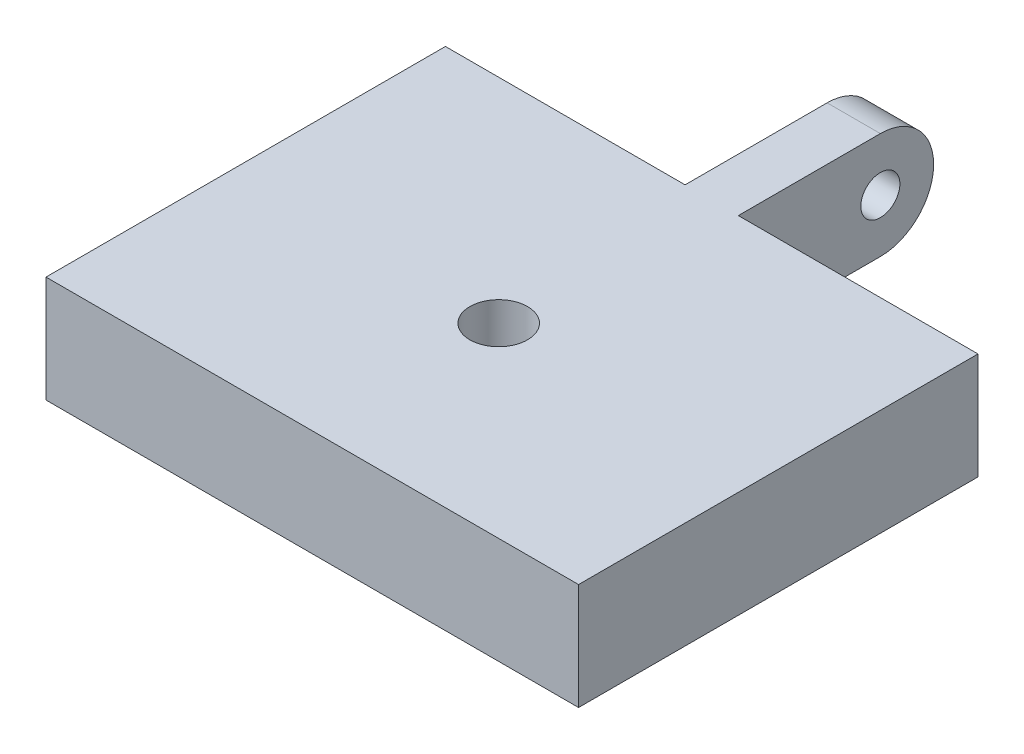
ISO-10303-21;
HEADER;
FILE_DESCRIPTION(('STEP AP214'),'2;1');
FILE_NAME('part.step','',(''),(''),'','','');
FILE_SCHEMA(('AUTOMOTIVE_DESIGN { 1 0 10303 214 1 1 1 1 }'));
ENDSEC;
DATA;
#1=APPLICATION_CONTEXT('core data for automotive mechanical design processes');
#2=APPLICATION_PROTOCOL_DEFINITION('international standard','automotive_design',2000,#1);
#3=PRODUCT_CONTEXT('',#1,'mechanical');
#4=PRODUCT('Part','Part','',(#3));
#5=PRODUCT_RELATED_PRODUCT_CATEGORY('part','',(#4));
#6=PRODUCT_DEFINITION_FORMATION('','',#4);
#7=PRODUCT_DEFINITION_CONTEXT('part definition',#1,'design');
#8=PRODUCT_DEFINITION('design','',#6,#7);
#9=PRODUCT_DEFINITION_SHAPE('','',#8);
#10=(LENGTH_UNIT() NAMED_UNIT(*) SI_UNIT(.MILLI.,.METRE.));
#11=(NAMED_UNIT(*) PLANE_ANGLE_UNIT() SI_UNIT($,.RADIAN.));
#12=(NAMED_UNIT(*) SI_UNIT($,.STERADIAN.) SOLID_ANGLE_UNIT());
#13=UNCERTAINTY_MEASURE_WITH_UNIT(LENGTH_MEASURE(1.E-05),#10,'distance_accuracy_value','');
#14=(GEOMETRIC_REPRESENTATION_CONTEXT(3) GLOBAL_UNCERTAINTY_ASSIGNED_CONTEXT((#13)) GLOBAL_UNIT_ASSIGNED_CONTEXT((#10,
#11,#12)) REPRESENTATION_CONTEXT('',''));
#15=CARTESIAN_POINT('',(0.,0.,0.));
#16=DIRECTION('',(0.,0.,1.));
#17=DIRECTION('',(1.,0.,0.));
#18=AXIS2_PLACEMENT_3D('',#15,#16,#17);
#19=CARTESIAN_POINT('',(3.,0.,0.));
#20=DIRECTION('',(1.,0.,0.));
#21=DIRECTION('',(0.,0.,-1.));
#22=AXIS2_PLACEMENT_3D('',#19,#20,#21);
#23=PLANE('',#22);
#24=CARTESIAN_POINT('',(3.,0.,0.));
#25=DIRECTION('',(1.,0.,0.));
#26=DIRECTION('',(0.,0.,-1.));
#27=AXIS2_PLACEMENT_3D('',#24,#25,#26);
#28=CIRCLE('',#27,2.2);
#29=CARTESIAN_POINT('',(3.,0.,-2.2));
#30=VERTEX_POINT('',#29);
#31=EDGE_CURVE('E193',#30,#30,#28,.F.);
#32=ORIENTED_EDGE('',*,*,#31,.T.);
#33=EDGE_LOOP('',(#32));
#34=FACE_BOUND('',#33,.T.);
#35=DIRECTION('',(0.,0.,1.));
#36=VECTOR('',#35,1.);
#37=CARTESIAN_POINT('',(3.,6.,18.));
#38=LINE('',#37,#36);
#39=CARTESIAN_POINT('',(3.,6.,0.));
#40=VERTEX_POINT('',#39);
#41=CARTESIAN_POINT('',(3.,6.,16.));
#42=VERTEX_POINT('',#41);
#43=EDGE_CURVE('E143',#40,#42,#38,.T.);
#44=ORIENTED_EDGE('',*,*,#43,.T.);
#45=DIRECTION('',(0.,-1.,0.));
#46=VECTOR('',#45,1.);
#47=CARTESIAN_POINT('',(3.,0.,16.));
#48=LINE('',#47,#46);
#49=CARTESIAN_POINT('',(3.,-6.,16.));
#50=VERTEX_POINT('',#49);
#51=EDGE_CURVE('E112',#42,#50,#48,.T.);
#52=ORIENTED_EDGE('',*,*,#51,.T.);
#53=DIRECTION('',(0.,0.,-1.));
#54=VECTOR('',#53,1.);
#55=CARTESIAN_POINT('',(3.,-6.,18.));
#56=LINE('',#55,#54);
#57=CARTESIAN_POINT('',(3.,-6.,0.));
#58=VERTEX_POINT('',#57);
#59=EDGE_CURVE('E55',#50,#58,#56,.T.);
#60=ORIENTED_EDGE('',*,*,#59,.T.);
#61=CARTESIAN_POINT('',(3.,0.,0.));
#62=DIRECTION('',(1.,0.,0.));
#63=DIRECTION('',(0.,0.,-1.));
#64=AXIS2_PLACEMENT_3D('',#61,#62,#63);
#65=CIRCLE('',#64,6.);
#66=EDGE_CURVE('E11',#58,#40,#65,.T.);
#67=ORIENTED_EDGE('',*,*,#66,.T.);
#68=EDGE_LOOP('',(#44,#52,#60,#67));
#69=FACE_BOUND('',#68,.T.);
#70=ADVANCED_FACE('F39',(#34,#69),#23,.T.);
#71=CARTESIAN_POINT('',(-3.,0.,0.));
#72=DIRECTION('',(1.,0.,0.));
#73=DIRECTION('',(0.,0.,-1.));
#74=AXIS2_PLACEMENT_3D('',#71,#72,#73);
#75=PLANE('',#74);
#76=CARTESIAN_POINT('',(-3.,0.,0.));
#77=DIRECTION('',(1.,0.,0.));
#78=DIRECTION('',(0.,0.,-1.));
#79=AXIS2_PLACEMENT_3D('',#76,#77,#78);
#80=CIRCLE('',#79,2.2);
#81=CARTESIAN_POINT('',(-3.,0.,-2.2));
#82=VERTEX_POINT('',#81);
#83=EDGE_CURVE('E43',#82,#82,#80,.F.);
#84=ORIENTED_EDGE('',*,*,#83,.F.);
#85=EDGE_LOOP('',(#84));
#86=FACE_BOUND('',#85,.T.);
#87=DIRECTION('',(0.,-1.,0.));
#88=VECTOR('',#87,1.);
#89=CARTESIAN_POINT('',(-3.,0.,16.));
#90=LINE('',#89,#88);
#91=CARTESIAN_POINT('',(-3.,6.,16.));
#92=VERTEX_POINT('',#91);
#93=CARTESIAN_POINT('',(-3.,-6.,16.));
#94=VERTEX_POINT('',#93);
#95=EDGE_CURVE('E132',#92,#94,#90,.T.);
#96=ORIENTED_EDGE('',*,*,#95,.F.);
#97=DIRECTION('',(0.,0.,1.));
#98=VECTOR('',#97,1.);
#99=CARTESIAN_POINT('',(-3.,6.,18.));
#100=LINE('',#99,#98);
#101=CARTESIAN_POINT('',(-3.,6.,0.));
#102=VERTEX_POINT('',#101);
#103=EDGE_CURVE('E142',#102,#92,#100,.T.);
#104=ORIENTED_EDGE('',*,*,#103,.F.);
#105=CARTESIAN_POINT('',(-3.,0.,0.));
#106=DIRECTION('',(1.,0.,0.));
#107=DIRECTION('',(0.,0.,-1.));
#108=AXIS2_PLACEMENT_3D('',#105,#106,#107);
#109=CIRCLE('',#108,6.);
#110=CARTESIAN_POINT('',(-3.,-6.,0.));
#111=VERTEX_POINT('',#110);
#112=EDGE_CURVE('E48',#111,#102,#109,.T.);
#113=ORIENTED_EDGE('',*,*,#112,.F.);
#114=DIRECTION('',(0.,0.,-1.));
#115=VECTOR('',#114,1.);
#116=CARTESIAN_POINT('',(-3.,-6.,18.));
#117=LINE('',#116,#115);
#118=EDGE_CURVE('E145',#94,#111,#117,.T.);
#119=ORIENTED_EDGE('',*,*,#118,.F.);
#120=EDGE_LOOP('',(#96,#104,#113,#119));
#121=FACE_BOUND('',#120,.T.);
#122=ADVANCED_FACE('F159',(#86,#121),#75,.F.);
#123=CARTESIAN_POINT('',(3.,0.,0.));
#124=DIRECTION('',(-1.,0.,0.));
#125=DIRECTION('',(0.,0.,1.));
#126=AXIS2_PLACEMENT_3D('',#123,#124,#125);
#127=CYLINDRICAL_SURFACE('',#126,6.);
#128=DIRECTION('',(-1.,0.,0.));
#129=VECTOR('',#128,1.);
#130=CARTESIAN_POINT('',(3.,6.,0.));
#131=LINE('',#130,#129);
#132=EDGE_CURVE('E62',#40,#102,#131,.T.);
#133=ORIENTED_EDGE('',*,*,#132,.F.);
#134=ORIENTED_EDGE('',*,*,#66,.F.);
#135=DIRECTION('',(-1.,0.,0.));
#136=VECTOR('',#135,1.);
#137=CARTESIAN_POINT('',(3.,-6.,0.));
#138=LINE('',#137,#136);
#139=EDGE_CURVE('E147',#58,#111,#138,.T.);
#140=ORIENTED_EDGE('',*,*,#139,.T.);
#141=ORIENTED_EDGE('',*,*,#112,.T.);
#142=EDGE_LOOP('',(#133,#134,#140,#141));
#143=FACE_BOUND('',#142,.T.);
#144=ADVANCED_FACE('F41',(#143),#127,.T.);
#145=CARTESIAN_POINT('',(3.,6.,18.));
#146=DIRECTION('',(0.,-1.,0.));
#147=DIRECTION('',(0.,0.,-1.));
#148=AXIS2_PLACEMENT_3D('',#145,#146,#147);
#149=PLANE('',#148);
#150=CARTESIAN_POINT('',(0.,6.,40.));
#151=DIRECTION('',(0.,1.,0.));
#152=DIRECTION('',(0.,0.,1.));
#153=AXIS2_PLACEMENT_3D('',#150,#151,#152);
#154=CIRCLE('',#153,3.25);
#155=CARTESIAN_POINT('',(0.,6.,43.25));
#156=VERTEX_POINT('',#155);
#157=EDGE_CURVE('E171',#156,#156,#154,.T.);
#158=ORIENTED_EDGE('',*,*,#157,.F.);
#159=EDGE_LOOP('',(#158));
#160=FACE_BOUND('',#159,.T.);
#161=DIRECTION('',(-1.,0.,0.));
#162=VECTOR('',#161,1.);
#163=CARTESIAN_POINT('',(-30.,6.,16.));
#164=LINE('',#163,#162);
#165=CARTESIAN_POINT('',(30.,6.,16.));
#166=VERTEX_POINT('',#165);
#167=EDGE_CURVE('E106',#166,#42,#164,.T.);
#168=ORIENTED_EDGE('',*,*,#167,.T.);
#169=ORIENTED_EDGE('',*,*,#43,.F.);
#170=ORIENTED_EDGE('',*,*,#132,.T.);
#171=ORIENTED_EDGE('',*,*,#103,.T.);
#172=CARTESIAN_POINT('',(-30.,6.,16.));
#173=VERTEX_POINT('',#172);
#174=EDGE_CURVE('E117',#92,#173,#164,.T.);
#175=ORIENTED_EDGE('',*,*,#174,.T.);
#176=DIRECTION('',(0.,0.,1.));
#177=VECTOR('',#176,1.);
#178=CARTESIAN_POINT('',(-30.,6.,61.));
#179=LINE('',#178,#177);
#180=CARTESIAN_POINT('',(-30.,6.,61.));
#181=VERTEX_POINT('',#180);
#182=EDGE_CURVE('E116',#173,#181,#179,.T.);
#183=ORIENTED_EDGE('',*,*,#182,.T.);
#184=DIRECTION('',(1.,0.,0.));
#185=VECTOR('',#184,1.);
#186=CARTESIAN_POINT('',(-30.,6.,61.));
#187=LINE('',#186,#185);
#188=CARTESIAN_POINT('',(30.,6.,61.));
#189=VERTEX_POINT('',#188);
#190=EDGE_CURVE('E123',#181,#189,#187,.T.);
#191=ORIENTED_EDGE('',*,*,#190,.T.);
#192=DIRECTION('',(0.,0.,-1.));
#193=VECTOR('',#192,1.);
#194=CARTESIAN_POINT('',(30.,6.,61.));
#195=LINE('',#194,#193);
#196=EDGE_CURVE('E120',#189,#166,#195,.T.);
#197=ORIENTED_EDGE('',*,*,#196,.T.);
#198=EDGE_LOOP('',(#168,#169,#170,#171,#175,#183,#191,#197));
#199=FACE_BOUND('',#198,.T.);
#200=ADVANCED_FACE('F121',(#160,#199),#149,.F.);
#201=CARTESIAN_POINT('',(3.,-6.,18.));
#202=DIRECTION('',(0.,1.,0.));
#203=DIRECTION('',(0.,0.,1.));
#204=AXIS2_PLACEMENT_3D('',#201,#202,#203);
#205=PLANE('',#204);
#206=CARTESIAN_POINT('',(0.,-6.,40.));
#207=DIRECTION('',(0.,1.,0.));
#208=DIRECTION('',(0.,0.,1.));
#209=AXIS2_PLACEMENT_3D('',#206,#207,#208);
#210=CIRCLE('',#209,3.25);
#211=CARTESIAN_POINT('',(0.,-6.,43.25));
#212=VERTEX_POINT('',#211);
#213=EDGE_CURVE('E190',#212,#212,#210,.T.);
#214=ORIENTED_EDGE('',*,*,#213,.T.);
#215=EDGE_LOOP('',(#214));
#216=FACE_BOUND('',#215,.T.);
#217=ORIENTED_EDGE('',*,*,#59,.F.);
#218=DIRECTION('',(-1.,0.,0.));
#219=VECTOR('',#218,1.);
#220=CARTESIAN_POINT('',(-30.,-6.,16.));
#221=LINE('',#220,#219);
#222=CARTESIAN_POINT('',(30.,-6.,16.));
#223=VERTEX_POINT('',#222);
#224=EDGE_CURVE('E169',#223,#50,#221,.T.);
#225=ORIENTED_EDGE('',*,*,#224,.F.);
#226=DIRECTION('',(0.,0.,-1.));
#227=VECTOR('',#226,1.);
#228=CARTESIAN_POINT('',(30.,-6.,61.));
#229=LINE('',#228,#227);
#230=CARTESIAN_POINT('',(30.,-6.,61.));
#231=VERTEX_POINT('',#230);
#232=EDGE_CURVE('E131',#231,#223,#229,.T.);
#233=ORIENTED_EDGE('',*,*,#232,.F.);
#234=DIRECTION('',(1.,0.,0.));
#235=VECTOR('',#234,1.);
#236=CARTESIAN_POINT('',(-30.,-6.,61.));
#237=LINE('',#236,#235);
#238=CARTESIAN_POINT('',(-30.,-6.,61.));
#239=VERTEX_POINT('',#238);
#240=EDGE_CURVE('E127',#239,#231,#237,.T.);
#241=ORIENTED_EDGE('',*,*,#240,.F.);
#242=DIRECTION('',(0.,0.,1.));
#243=VECTOR('',#242,1.);
#244=CARTESIAN_POINT('',(-30.,-6.,61.));
#245=LINE('',#244,#243);
#246=CARTESIAN_POINT('',(-30.,-6.,16.));
#247=VERTEX_POINT('',#246);
#248=EDGE_CURVE('E166',#247,#239,#245,.T.);
#249=ORIENTED_EDGE('',*,*,#248,.F.);
#250=EDGE_CURVE('E164',#94,#247,#221,.T.);
#251=ORIENTED_EDGE('',*,*,#250,.F.);
#252=ORIENTED_EDGE('',*,*,#118,.T.);
#253=ORIENTED_EDGE('',*,*,#139,.F.);
#254=EDGE_LOOP('',(#217,#225,#233,#241,#249,#251,#252,#253));
#255=FACE_BOUND('',#254,.T.);
#256=ADVANCED_FACE('F161',(#216,#255),#205,.F.);
#257=CARTESIAN_POINT('',(-30.,6.,16.));
#258=DIRECTION('',(0.,0.,1.));
#259=DIRECTION('',(1.,0.,0.));
#260=AXIS2_PLACEMENT_3D('',#257,#258,#259);
#261=PLANE('',#260);
#262=ORIENTED_EDGE('',*,*,#174,.F.);
#263=ORIENTED_EDGE('',*,*,#95,.T.);
#264=ORIENTED_EDGE('',*,*,#250,.T.);
#265=DIRECTION('',(0.,-1.,0.));
#266=VECTOR('',#265,1.);
#267=CARTESIAN_POINT('',(-30.,6.,16.));
#268=LINE('',#267,#266);
#269=EDGE_CURVE('E133',#173,#247,#268,.T.);
#270=ORIENTED_EDGE('',*,*,#269,.F.);
#271=EDGE_LOOP('',(#262,#263,#264,#270));
#272=FACE_BOUND('',#271,.T.);
#273=ADVANCED_FACE('F185',(#272),#261,.F.);
#274=CARTESIAN_POINT('',(30.,6.,61.));
#275=DIRECTION('',(-1.,0.,0.));
#276=DIRECTION('',(0.,0.,1.));
#277=AXIS2_PLACEMENT_3D('',#274,#275,#276);
#278=PLANE('',#277);
#279=ORIENTED_EDGE('',*,*,#232,.T.);
#280=DIRECTION('',(0.,-1.,0.));
#281=VECTOR('',#280,1.);
#282=CARTESIAN_POINT('',(30.,6.,16.));
#283=LINE('',#282,#281);
#284=EDGE_CURVE('E110',#166,#223,#283,.T.);
#285=ORIENTED_EDGE('',*,*,#284,.F.);
#286=ORIENTED_EDGE('',*,*,#196,.F.);
#287=DIRECTION('',(0.,-1.,0.));
#288=VECTOR('',#287,1.);
#289=CARTESIAN_POINT('',(30.,6.,61.));
#290=LINE('',#289,#288);
#291=EDGE_CURVE('E177',#189,#231,#290,.T.);
#292=ORIENTED_EDGE('',*,*,#291,.T.);
#293=EDGE_LOOP('',(#279,#285,#286,#292));
#294=FACE_BOUND('',#293,.T.);
#295=ADVANCED_FACE('F129',(#294),#278,.F.);
#296=ORIENTED_EDGE('',*,*,#51,.F.);
#297=ORIENTED_EDGE('',*,*,#167,.F.);
#298=ORIENTED_EDGE('',*,*,#284,.T.);
#299=ORIENTED_EDGE('',*,*,#224,.T.);
#300=EDGE_LOOP('',(#296,#297,#298,#299));
#301=FACE_BOUND('',#300,.T.);
#302=ADVANCED_FACE('F108',(#301),#261,.F.);
#303=CARTESIAN_POINT('',(-30.,6.,61.));
#304=DIRECTION('',(1.,0.,0.));
#305=DIRECTION('',(0.,0.,-1.));
#306=AXIS2_PLACEMENT_3D('',#303,#304,#305);
#307=PLANE('',#306);
#308=ORIENTED_EDGE('',*,*,#248,.T.);
#309=DIRECTION('',(0.,-1.,0.));
#310=VECTOR('',#309,1.);
#311=CARTESIAN_POINT('',(-30.,6.,61.));
#312=LINE('',#311,#310);
#313=EDGE_CURVE('E137',#181,#239,#312,.T.);
#314=ORIENTED_EDGE('',*,*,#313,.F.);
#315=ORIENTED_EDGE('',*,*,#182,.F.);
#316=ORIENTED_EDGE('',*,*,#269,.T.);
#317=EDGE_LOOP('',(#308,#314,#315,#316));
#318=FACE_BOUND('',#317,.T.);
#319=ADVANCED_FACE('F184',(#318),#307,.F.);
#320=CARTESIAN_POINT('',(-30.,6.,61.));
#321=DIRECTION('',(0.,0.,-1.));
#322=DIRECTION('',(-1.,0.,0.));
#323=AXIS2_PLACEMENT_3D('',#320,#321,#322);
#324=PLANE('',#323);
#325=ORIENTED_EDGE('',*,*,#240,.T.);
#326=ORIENTED_EDGE('',*,*,#291,.F.);
#327=ORIENTED_EDGE('',*,*,#190,.F.);
#328=ORIENTED_EDGE('',*,*,#313,.T.);
#329=EDGE_LOOP('',(#325,#326,#327,#328));
#330=FACE_BOUND('',#329,.T.);
#331=ADVANCED_FACE('F181',(#330),#324,.F.);
#332=CARTESIAN_POINT('',(0.,6.,40.));
#333=DIRECTION('',(0.,-1.,0.));
#334=DIRECTION('',(0.,0.,-1.));
#335=AXIS2_PLACEMENT_3D('',#332,#333,#334);
#336=CYLINDRICAL_SURFACE('',#335,3.25);
#337=ORIENTED_EDGE('',*,*,#157,.T.);
#338=EDGE_LOOP('',(#337));
#339=FACE_BOUND('',#338,.T.);
#340=ORIENTED_EDGE('',*,*,#213,.F.);
#341=EDGE_LOOP('',(#340));
#342=FACE_BOUND('',#341,.T.);
#343=ADVANCED_FACE('F224',(#339,#342),#336,.F.);
#344=CARTESIAN_POINT('',(30.,0.,0.));
#345=DIRECTION('',(-1.,0.,0.));
#346=DIRECTION('',(0.,0.,1.));
#347=AXIS2_PLACEMENT_3D('',#344,#345,#346);
#348=CYLINDRICAL_SURFACE('',#347,2.2);
#349=ORIENTED_EDGE('',*,*,#31,.F.);
#350=EDGE_LOOP('',(#349));
#351=FACE_BOUND('',#350,.T.);
#352=ORIENTED_EDGE('',*,*,#83,.T.);
#353=EDGE_LOOP('',(#352));
#354=FACE_BOUND('',#353,.T.);
#355=ADVANCED_FACE('F200',(#351,#354),#348,.F.);
#356=CLOSED_SHELL('',(#70,#122,#144,#200,#256,#273,#295,#302,#319,#331,#343,#355));
#357=MANIFOLD_SOLID_BREP('B2',#356);
#358=ADVANCED_BREP_SHAPE_REPRESENTATION('',(#18,#357),#14);
#359=SHAPE_DEFINITION_REPRESENTATION(#9,#358);
ENDSEC;
END-ISO-10303-21;
